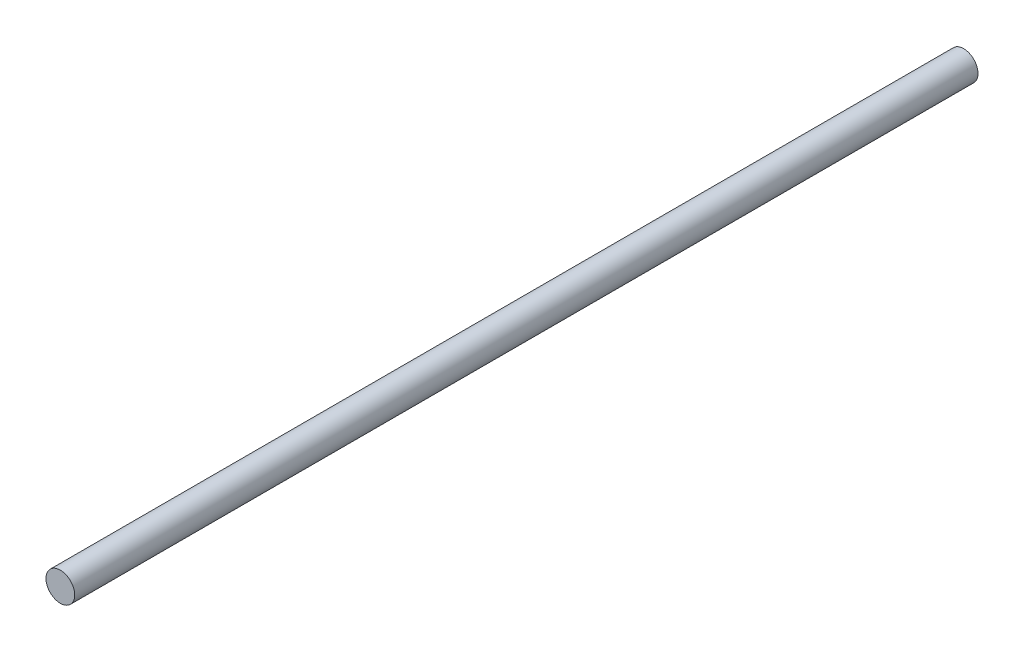
ISO-10303-21;
HEADER;
FILE_DESCRIPTION(('STEP AP214'),'2;1');
FILE_NAME('part.step','',(''),(''),'','','');
FILE_SCHEMA(('AUTOMOTIVE_DESIGN { 1 0 10303 214 1 1 1 1 }'));
ENDSEC;
DATA;
#1=APPLICATION_CONTEXT('core data for automotive mechanical design processes');
#2=APPLICATION_PROTOCOL_DEFINITION('international standard','automotive_design',2000,#1);
#3=PRODUCT_CONTEXT('',#1,'mechanical');
#4=PRODUCT('Part','Part','',(#3));
#5=PRODUCT_RELATED_PRODUCT_CATEGORY('part','',(#4));
#6=PRODUCT_DEFINITION_FORMATION('','',#4);
#7=PRODUCT_DEFINITION_CONTEXT('part definition',#1,'design');
#8=PRODUCT_DEFINITION('design','',#6,#7);
#9=PRODUCT_DEFINITION_SHAPE('','',#8);
#10=(LENGTH_UNIT() NAMED_UNIT(*) SI_UNIT(.MILLI.,.METRE.));
#11=(NAMED_UNIT(*) PLANE_ANGLE_UNIT() SI_UNIT($,.RADIAN.));
#12=(NAMED_UNIT(*) SI_UNIT($,.STERADIAN.) SOLID_ANGLE_UNIT());
#13=UNCERTAINTY_MEASURE_WITH_UNIT(LENGTH_MEASURE(1.E-05),#10,'distance_accuracy_value','');
#14=(GEOMETRIC_REPRESENTATION_CONTEXT(3) GLOBAL_UNCERTAINTY_ASSIGNED_CONTEXT((#13)) GLOBAL_UNIT_ASSIGNED_CONTEXT((#10,
#11,#12)) REPRESENTATION_CONTEXT('',''));
#15=CARTESIAN_POINT('',(0.,0.,0.));
#16=DIRECTION('',(0.,0.,1.));
#17=DIRECTION('',(1.,0.,0.));
#18=AXIS2_PLACEMENT_3D('',#15,#16,#17);
#19=CARTESIAN_POINT('',(0.,0.,0.));
#20=DIRECTION('',(0.,0.,1.));
#21=DIRECTION('',(1.,0.,0.));
#22=AXIS2_PLACEMENT_3D('',#19,#20,#21);
#23=PLANE('',#22);
#24=CARTESIAN_POINT('',(0.,0.,0.));
#25=DIRECTION('',(0.,0.,1.));
#26=DIRECTION('',(1.,0.,0.));
#27=AXIS2_PLACEMENT_3D('',#24,#25,#26);
#28=CIRCLE('',#27,3.5);
#29=CARTESIAN_POINT('',(3.5,0.,0.));
#30=VERTEX_POINT('',#29);
#31=EDGE_CURVE('E9',#30,#30,#28,.T.);
#32=ORIENTED_EDGE('',*,*,#31,.F.);
#33=EDGE_LOOP('',(#32));
#34=FACE_BOUND('',#33,.T.);
#35=ADVANCED_FACE('F14',(#34),#23,.F.);
#36=CARTESIAN_POINT('',(0.,0.,220.));
#37=DIRECTION('',(0.,0.,1.));
#38=DIRECTION('',(1.,0.,0.));
#39=AXIS2_PLACEMENT_3D('',#36,#37,#38);
#40=PLANE('',#39);
#41=CARTESIAN_POINT('',(0.,0.,220.));
#42=DIRECTION('',(0.,0.,1.));
#43=DIRECTION('',(1.,0.,0.));
#44=AXIS2_PLACEMENT_3D('',#41,#42,#43);
#45=CIRCLE('',#44,3.5);
#46=CARTESIAN_POINT('',(3.5,0.,220.));
#47=VERTEX_POINT('',#46);
#48=EDGE_CURVE('E21',#47,#47,#45,.T.);
#49=ORIENTED_EDGE('',*,*,#48,.T.);
#50=EDGE_LOOP('',(#49));
#51=FACE_BOUND('',#50,.T.);
#52=ADVANCED_FACE('F35',(#51),#40,.T.);
#53=CARTESIAN_POINT('',(0.,0.,0.));
#54=DIRECTION('',(0.,0.,1.));
#55=DIRECTION('',(1.,0.,0.));
#56=AXIS2_PLACEMENT_3D('',#53,#54,#55);
#57=CYLINDRICAL_SURFACE('',#56,3.5);
#58=ORIENTED_EDGE('',*,*,#48,.F.);
#59=EDGE_LOOP('',(#58));
#60=FACE_BOUND('',#59,.T.);
#61=ORIENTED_EDGE('',*,*,#31,.T.);
#62=EDGE_LOOP('',(#61));
#63=FACE_BOUND('',#62,.T.);
#64=ADVANCED_FACE('F38',(#60,#63),#57,.T.);
#65=CLOSED_SHELL('',(#35,#52,#64));
#66=MANIFOLD_SOLID_BREP('B1',#65);
#67=ADVANCED_BREP_SHAPE_REPRESENTATION('',(#18,#66),#14);
#68=SHAPE_DEFINITION_REPRESENTATION(#9,#67);
ENDSEC;
END-ISO-10303-21;
